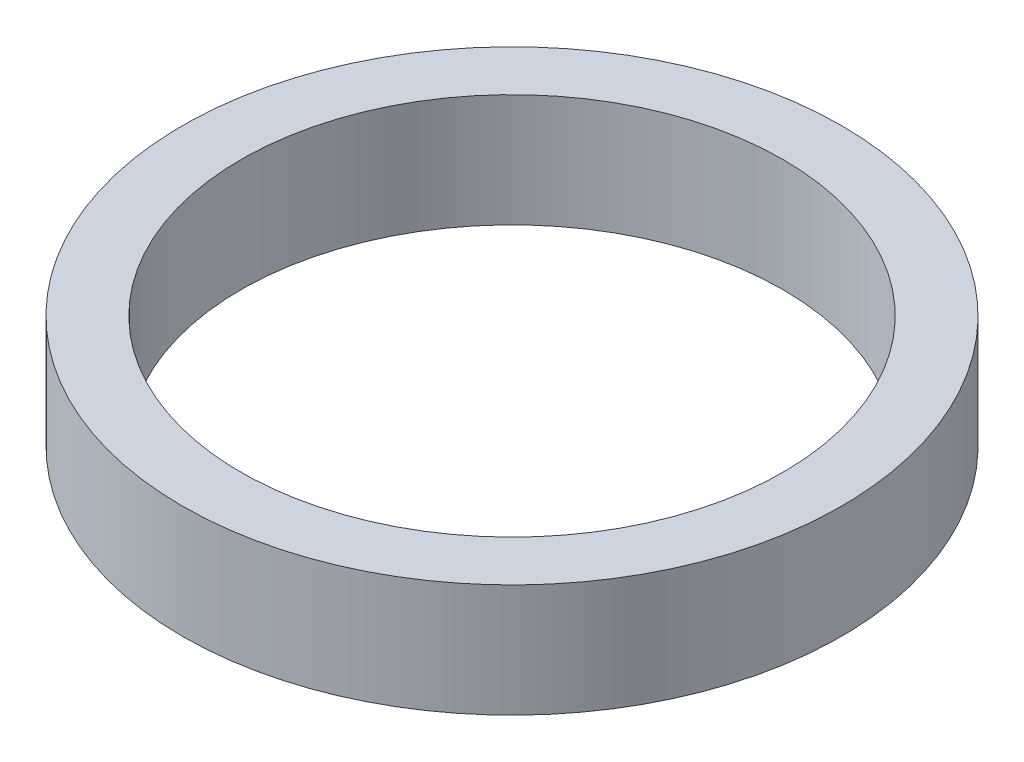
ISO-10303-21;
HEADER;
FILE_DESCRIPTION(('STEP AP214'),'2;1');
FILE_NAME('part.step','',(''),(''),'','','');
FILE_SCHEMA(('AUTOMOTIVE_DESIGN { 1 0 10303 214 1 1 1 1 }'));
ENDSEC;
DATA;
#1=APPLICATION_CONTEXT('core data for automotive mechanical design processes');
#2=APPLICATION_PROTOCOL_DEFINITION('international standard','automotive_design',2000,#1);
#3=PRODUCT_CONTEXT('',#1,'mechanical');
#4=PRODUCT('Part','Part','',(#3));
#5=PRODUCT_RELATED_PRODUCT_CATEGORY('part','',(#4));
#6=PRODUCT_DEFINITION_FORMATION('','',#4);
#7=PRODUCT_DEFINITION_CONTEXT('part definition',#1,'design');
#8=PRODUCT_DEFINITION('design','',#6,#7);
#9=PRODUCT_DEFINITION_SHAPE('','',#8);
#10=(LENGTH_UNIT() NAMED_UNIT(*) SI_UNIT(.MILLI.,.METRE.));
#11=(NAMED_UNIT(*) PLANE_ANGLE_UNIT() SI_UNIT($,.RADIAN.));
#12=(NAMED_UNIT(*) SI_UNIT($,.STERADIAN.) SOLID_ANGLE_UNIT());
#13=UNCERTAINTY_MEASURE_WITH_UNIT(LENGTH_MEASURE(1.E-05),#10,'distance_accuracy_value','');
#14=(GEOMETRIC_REPRESENTATION_CONTEXT(3) GLOBAL_UNCERTAINTY_ASSIGNED_CONTEXT((#13)) GLOBAL_UNIT_ASSIGNED_CONTEXT((#10,
#11,#12)) REPRESENTATION_CONTEXT('',''));
#15=CARTESIAN_POINT('',(0.,0.,0.));
#16=DIRECTION('',(0.,0.,1.));
#17=DIRECTION('',(1.,0.,0.));
#18=AXIS2_PLACEMENT_3D('',#15,#16,#17);
#19=CARTESIAN_POINT('',(0.,7.7,0.));
#20=DIRECTION('',(0.,1.,0.));
#21=DIRECTION('',(0.,0.,1.));
#22=AXIS2_PLACEMENT_3D('',#19,#20,#21);
#23=PLANE('',#22);
#24=CARTESIAN_POINT('',(0.,7.7,0.));
#25=DIRECTION('',(0.,1.,0.));
#26=DIRECTION('',(0.,0.,1.));
#27=AXIS2_PLACEMENT_3D('',#24,#25,#26);
#28=CIRCLE('',#27,22.5);
#29=CARTESIAN_POINT('',(0.,7.7,-22.5));
#30=VERTEX_POINT('',#29);
#31=EDGE_CURVE('E10',#30,#30,#28,.T.);
#32=ORIENTED_EDGE('',*,*,#31,.T.);
#33=EDGE_LOOP('',(#32));
#34=FACE_BOUND('',#33,.T.);
#35=CARTESIAN_POINT('',(0.,7.7,0.));
#36=DIRECTION('',(0.,1.,0.));
#37=DIRECTION('',(0.,0.,1.));
#38=AXIS2_PLACEMENT_3D('',#35,#36,#37);
#39=CIRCLE('',#38,18.5);
#40=CARTESIAN_POINT('',(0.,7.7,-18.5));
#41=VERTEX_POINT('',#40);
#42=EDGE_CURVE('E44',#41,#41,#39,.T.);
#43=ORIENTED_EDGE('',*,*,#42,.F.);
#44=EDGE_LOOP('',(#43));
#45=FACE_BOUND('',#44,.T.);
#46=ADVANCED_FACE('F33',(#34,#45),#23,.T.);
#47=CARTESIAN_POINT('',(0.,0.,0.));
#48=DIRECTION('',(0.,1.,0.));
#49=DIRECTION('',(0.,0.,1.));
#50=AXIS2_PLACEMENT_3D('',#47,#48,#49);
#51=PLANE('',#50);
#52=CARTESIAN_POINT('',(0.,0.,0.));
#53=DIRECTION('',(0.,1.,0.));
#54=DIRECTION('',(0.,0.,1.));
#55=AXIS2_PLACEMENT_3D('',#52,#53,#54);
#56=CIRCLE('',#55,22.5);
#57=CARTESIAN_POINT('',(0.,0.,-22.5));
#58=VERTEX_POINT('',#57);
#59=EDGE_CURVE('E37',#58,#58,#56,.T.);
#60=ORIENTED_EDGE('',*,*,#59,.F.);
#61=EDGE_LOOP('',(#60));
#62=FACE_BOUND('',#61,.T.);
#63=CARTESIAN_POINT('',(0.,0.,0.));
#64=DIRECTION('',(0.,1.,0.));
#65=DIRECTION('',(0.,0.,1.));
#66=AXIS2_PLACEMENT_3D('',#63,#64,#65);
#67=CIRCLE('',#66,18.5);
#68=CARTESIAN_POINT('',(0.,0.,-18.5));
#69=VERTEX_POINT('',#68);
#70=EDGE_CURVE('E46',#69,#69,#67,.T.);
#71=ORIENTED_EDGE('',*,*,#70,.T.);
#72=EDGE_LOOP('',(#71));
#73=FACE_BOUND('',#72,.T.);
#74=ADVANCED_FACE('F56',(#62,#73),#51,.F.);
#75=CARTESIAN_POINT('',(0.,7.7,0.));
#76=DIRECTION('',(0.,-1.,0.));
#77=DIRECTION('',(0.,0.,-1.));
#78=AXIS2_PLACEMENT_3D('',#75,#76,#77);
#79=CYLINDRICAL_SURFACE('',#78,22.5);
#80=CARTESIAN_POINT('',(0.,7.7,-22.5));
#81=CARTESIAN_POINT('',(0.,7.61979166666667,-22.5));
#82=CARTESIAN_POINT('',(0.,7.53958333333333,-22.5));
#83=CARTESIAN_POINT('',(0.,7.37916666666667,-22.5));
#84=CARTESIAN_POINT('',(0.,7.29895833333333,-22.5));
#85=CARTESIAN_POINT('',(0.,7.13854166666667,-22.5));
#86=CARTESIAN_POINT('',(0.,7.05833333333333,-22.5));
#87=CARTESIAN_POINT('',(0.,6.89791666666667,-22.5));
#88=CARTESIAN_POINT('',(0.,6.81770833333333,-22.5));
#89=CARTESIAN_POINT('',(0.,6.65729166666667,-22.5));
#90=CARTESIAN_POINT('',(0.,6.57708333333333,-22.5));
#91=CARTESIAN_POINT('',(0.,6.41666666666667,-22.5));
#92=CARTESIAN_POINT('',(0.,6.33645833333333,-22.5));
#93=CARTESIAN_POINT('',(0.,6.17604166666667,-22.5));
#94=CARTESIAN_POINT('',(0.,6.09583333333333,-22.5));
#95=CARTESIAN_POINT('',(0.,5.93541666666667,-22.5));
#96=CARTESIAN_POINT('',(0.,5.85520833333333,-22.5));
#97=CARTESIAN_POINT('',(0.,5.69479166666667,-22.5));
#98=CARTESIAN_POINT('',(0.,5.61458333333333,-22.5));
#99=CARTESIAN_POINT('',(0.,5.45416666666667,-22.5));
#100=CARTESIAN_POINT('',(0.,5.37395833333333,-22.5));
#101=CARTESIAN_POINT('',(0.,5.21354166666667,-22.5));
#102=CARTESIAN_POINT('',(0.,5.13333333333333,-22.5));
#103=CARTESIAN_POINT('',(0.,4.97291666666667,-22.5));
#104=CARTESIAN_POINT('',(0.,4.89270833333333,-22.5));
#105=CARTESIAN_POINT('',(0.,4.73229166666667,-22.5));
#106=CARTESIAN_POINT('',(0.,4.65208333333333,-22.5));
#107=CARTESIAN_POINT('',(0.,4.49166666666667,-22.5));
#108=CARTESIAN_POINT('',(0.,4.41145833333333,-22.5));
#109=CARTESIAN_POINT('',(0.,4.25104166666667,-22.5));
#110=CARTESIAN_POINT('',(0.,4.17083333333333,-22.5));
#111=CARTESIAN_POINT('',(0.,4.01041666666667,-22.5));
#112=CARTESIAN_POINT('',(0.,3.93020833333333,-22.5));
#113=CARTESIAN_POINT('',(0.,3.76979166666667,-22.5));
#114=CARTESIAN_POINT('',(0.,3.68958333333333,-22.5));
#115=CARTESIAN_POINT('',(0.,3.52916666666667,-22.5));
#116=CARTESIAN_POINT('',(0.,3.44895833333333,-22.5));
#117=CARTESIAN_POINT('',(0.,3.28854166666667,-22.5));
#118=CARTESIAN_POINT('',(0.,3.20833333333333,-22.5));
#119=CARTESIAN_POINT('',(0.,3.04791666666667,-22.5));
#120=CARTESIAN_POINT('',(0.,2.96770833333333,-22.5));
#121=CARTESIAN_POINT('',(0.,2.80729166666667,-22.5));
#122=CARTESIAN_POINT('',(0.,2.72708333333333,-22.5));
#123=CARTESIAN_POINT('',(0.,2.56666666666667,-22.5));
#124=CARTESIAN_POINT('',(0.,2.48645833333333,-22.5));
#125=CARTESIAN_POINT('',(0.,2.32604166666667,-22.5));
#126=CARTESIAN_POINT('',(0.,2.24583333333333,-22.5));
#127=CARTESIAN_POINT('',(0.,2.08541666666667,-22.5));
#128=CARTESIAN_POINT('',(0.,2.00520833333333,-22.5));
#129=CARTESIAN_POINT('',(0.,1.84479166666667,-22.5));
#130=CARTESIAN_POINT('',(0.,1.76458333333333,-22.5));
#131=CARTESIAN_POINT('',(0.,1.60416666666667,-22.5));
#132=CARTESIAN_POINT('',(0.,1.52395833333333,-22.5));
#133=CARTESIAN_POINT('',(0.,1.36354166666667,-22.5));
#134=CARTESIAN_POINT('',(0.,1.28333333333333,-22.5));
#135=CARTESIAN_POINT('',(0.,1.12291666666667,-22.5));
#136=CARTESIAN_POINT('',(0.,1.04270833333333,-22.5));
#137=CARTESIAN_POINT('',(0.,0.882291666666666,-22.5));
#138=CARTESIAN_POINT('',(0.,0.802083333333333,-22.5));
#139=CARTESIAN_POINT('',(0.,0.641666666666666,-22.5));
#140=CARTESIAN_POINT('',(0.,0.561458333333332,-22.5));
#141=CARTESIAN_POINT('',(0.,0.401041666666666,-22.5));
#142=CARTESIAN_POINT('',(0.,0.320833333333333,-22.5));
#143=CARTESIAN_POINT('',(0.,0.160416666666666,-22.5));
#144=CARTESIAN_POINT('',(0.,0.0802083333333325,-22.5));
#145=CARTESIAN_POINT('',(0.,0.,-22.5));
#146=B_SPLINE_CURVE_WITH_KNOTS('',3,(#80,#81,#82,#83,#84,#85,#86,#87,#88,#89,#90,#91,#92,#93,
#94,#95,#96,#97,#98,#99,#100,#101,#102,#103,#104,#105,#106,#107,#108,#109,#110,#111,#112,#113,
#114,#115,#116,#117,#118,#119,#120,#121,#122,#123,#124,#125,#126,#127,#128,#129,#130,#131,#132,
#133,#134,#135,#136,#137,#138,#139,#140,#141,#142,#143,#144,#145),.UNSPECIFIED.,.F.,.F.,(4,2,2,
2,2,2,2,2,2,2,2,2,2,2,2,2,2,2,2,2,2,2,2,2,2,2,2,2,2,2,2,2,4),(0.,0.240625,0.481250000000001,
0.721875,0.962500000000001,1.203125,1.44375,1.684375,1.925,2.165625,2.40625,2.646875,2.8875,
3.128125,3.36875,3.609375,3.85,4.090625,4.33125,4.571875,4.8125,5.053125,5.29375,5.534375,5.775,
6.015625,6.25625,6.496875,6.7375,6.978125,7.21875,7.459375,7.7),.UNSPECIFIED.);
#147=EDGE_CURVE('BSEAM35',#30,#58,#146,.T.);
#148=ORIENTED_EDGE('',*,*,#31,.F.);
#149=ORIENTED_EDGE('',*,*,#59,.T.);
#150=ORIENTED_EDGE('',*,*,#147,.T.);
#151=ORIENTED_EDGE('',*,*,#147,.F.);
#152=EDGE_LOOP('',(#148,#150,#149,#151));
#153=FACE_BOUND('',#152,.T.);
#154=ADVANCED_FACE('F35',(#153),#79,.T.);
#155=CARTESIAN_POINT('',(0.,7.7,0.));
#156=DIRECTION('',(0.,-1.,0.));
#157=DIRECTION('',(0.,0.,-1.));
#158=AXIS2_PLACEMENT_3D('',#155,#156,#157);
#159=CYLINDRICAL_SURFACE('',#158,18.5);
#160=CARTESIAN_POINT('',(0.,7.7,-18.5));
#161=CARTESIAN_POINT('',(0.,7.61979166666667,-18.5));
#162=CARTESIAN_POINT('',(0.,7.53958333333333,-18.5));
#163=CARTESIAN_POINT('',(0.,7.37916666666667,-18.5));
#164=CARTESIAN_POINT('',(0.,7.29895833333333,-18.5));
#165=CARTESIAN_POINT('',(0.,7.13854166666667,-18.5));
#166=CARTESIAN_POINT('',(0.,7.05833333333333,-18.5));
#167=CARTESIAN_POINT('',(0.,6.89791666666667,-18.5));
#168=CARTESIAN_POINT('',(0.,6.81770833333333,-18.5));
#169=CARTESIAN_POINT('',(0.,6.65729166666667,-18.5));
#170=CARTESIAN_POINT('',(0.,6.57708333333333,-18.5));
#171=CARTESIAN_POINT('',(0.,6.41666666666667,-18.5));
#172=CARTESIAN_POINT('',(0.,6.33645833333333,-18.5));
#173=CARTESIAN_POINT('',(0.,6.17604166666667,-18.5));
#174=CARTESIAN_POINT('',(0.,6.09583333333333,-18.5));
#175=CARTESIAN_POINT('',(0.,5.93541666666667,-18.5));
#176=CARTESIAN_POINT('',(0.,5.85520833333333,-18.5));
#177=CARTESIAN_POINT('',(0.,5.69479166666667,-18.5));
#178=CARTESIAN_POINT('',(0.,5.61458333333333,-18.5));
#179=CARTESIAN_POINT('',(0.,5.45416666666667,-18.5));
#180=CARTESIAN_POINT('',(0.,5.37395833333333,-18.5));
#181=CARTESIAN_POINT('',(0.,5.21354166666667,-18.5));
#182=CARTESIAN_POINT('',(0.,5.13333333333333,-18.5));
#183=CARTESIAN_POINT('',(0.,4.97291666666667,-18.5));
#184=CARTESIAN_POINT('',(0.,4.89270833333333,-18.5));
#185=CARTESIAN_POINT('',(0.,4.73229166666667,-18.5));
#186=CARTESIAN_POINT('',(0.,4.65208333333333,-18.5));
#187=CARTESIAN_POINT('',(0.,4.49166666666667,-18.5));
#188=CARTESIAN_POINT('',(0.,4.41145833333333,-18.5));
#189=CARTESIAN_POINT('',(0.,4.25104166666667,-18.5));
#190=CARTESIAN_POINT('',(0.,4.17083333333333,-18.5));
#191=CARTESIAN_POINT('',(0.,4.01041666666667,-18.5));
#192=CARTESIAN_POINT('',(0.,3.93020833333333,-18.5));
#193=CARTESIAN_POINT('',(0.,3.76979166666667,-18.5));
#194=CARTESIAN_POINT('',(0.,3.68958333333333,-18.5));
#195=CARTESIAN_POINT('',(0.,3.52916666666667,-18.5));
#196=CARTESIAN_POINT('',(0.,3.44895833333333,-18.5));
#197=CARTESIAN_POINT('',(0.,3.28854166666667,-18.5));
#198=CARTESIAN_POINT('',(0.,3.20833333333333,-18.5));
#199=CARTESIAN_POINT('',(0.,3.04791666666667,-18.5));
#200=CARTESIAN_POINT('',(0.,2.96770833333333,-18.5));
#201=CARTESIAN_POINT('',(0.,2.80729166666667,-18.5));
#202=CARTESIAN_POINT('',(0.,2.72708333333333,-18.5));
#203=CARTESIAN_POINT('',(0.,2.56666666666667,-18.5));
#204=CARTESIAN_POINT('',(0.,2.48645833333333,-18.5));
#205=CARTESIAN_POINT('',(0.,2.32604166666667,-18.5));
#206=CARTESIAN_POINT('',(0.,2.24583333333333,-18.5));
#207=CARTESIAN_POINT('',(0.,2.08541666666667,-18.5));
#208=CARTESIAN_POINT('',(0.,2.00520833333333,-18.5));
#209=CARTESIAN_POINT('',(0.,1.84479166666667,-18.5));
#210=CARTESIAN_POINT('',(0.,1.76458333333333,-18.5));
#211=CARTESIAN_POINT('',(0.,1.60416666666667,-18.5));
#212=CARTESIAN_POINT('',(0.,1.52395833333333,-18.5));
#213=CARTESIAN_POINT('',(0.,1.36354166666667,-18.5));
#214=CARTESIAN_POINT('',(0.,1.28333333333333,-18.5));
#215=CARTESIAN_POINT('',(0.,1.12291666666667,-18.5));
#216=CARTESIAN_POINT('',(0.,1.04270833333333,-18.5));
#217=CARTESIAN_POINT('',(0.,0.882291666666666,-18.5));
#218=CARTESIAN_POINT('',(0.,0.802083333333333,-18.5));
#219=CARTESIAN_POINT('',(0.,0.641666666666666,-18.5));
#220=CARTESIAN_POINT('',(0.,0.561458333333332,-18.5));
#221=CARTESIAN_POINT('',(0.,0.401041666666666,-18.5));
#222=CARTESIAN_POINT('',(0.,0.320833333333333,-18.5));
#223=CARTESIAN_POINT('',(0.,0.160416666666666,-18.5));
#224=CARTESIAN_POINT('',(0.,0.0802083333333325,-18.5));
#225=CARTESIAN_POINT('',(0.,0.,-18.5));
#226=B_SPLINE_CURVE_WITH_KNOTS('',3,(#160,#161,#162,#163,#164,#165,#166,#167,#168,#169,#170,
#171,#172,#173,#174,#175,#176,#177,#178,#179,#180,#181,#182,#183,#184,#185,#186,#187,#188,#189,
#190,#191,#192,#193,#194,#195,#196,#197,#198,#199,#200,#201,#202,#203,#204,#205,#206,#207,#208,
#209,#210,#211,#212,#213,#214,#215,#216,#217,#218,#219,#220,#221,#222,#223,#224,#225),
.UNSPECIFIED.,.F.,.F.,(4,2,2,2,2,2,2,2,2,2,2,2,2,2,2,2,2,2,2,2,2,2,2,2,2,2,2,2,2,2,2,2,4),(0.,
0.240625,0.481250000000001,0.721875,0.962500000000001,1.203125,1.44375,1.684375,1.925,2.165625,
2.40625,2.646875,2.8875,3.128125,3.36875,3.609375,3.85,4.090625,4.33125,4.571875,4.8125,
5.053125,5.29375,5.534375,5.775,6.015625,6.25625,6.496875,6.7375,6.978125,7.21875,7.459375,7.7),.UNSPECIFIED.);
#227=EDGE_CURVE('BSEAM52',#41,#69,#226,.T.);
#228=ORIENTED_EDGE('',*,*,#42,.T.);
#229=ORIENTED_EDGE('',*,*,#70,.F.);
#230=ORIENTED_EDGE('',*,*,#227,.T.);
#231=ORIENTED_EDGE('',*,*,#227,.F.);
#232=EDGE_LOOP('',(#228,#230,#229,#231));
#233=FACE_BOUND('',#232,.T.);
#234=ADVANCED_FACE('F52',(#233),#159,.F.);
#235=CLOSED_SHELL('',(#46,#74,#154,#234));
#236=MANIFOLD_SOLID_BREP('B2',#235);
#237=ADVANCED_BREP_SHAPE_REPRESENTATION('',(#18,#236),#14);
#238=SHAPE_DEFINITION_REPRESENTATION(#9,#237);
ENDSEC;
END-ISO-10303-21;
